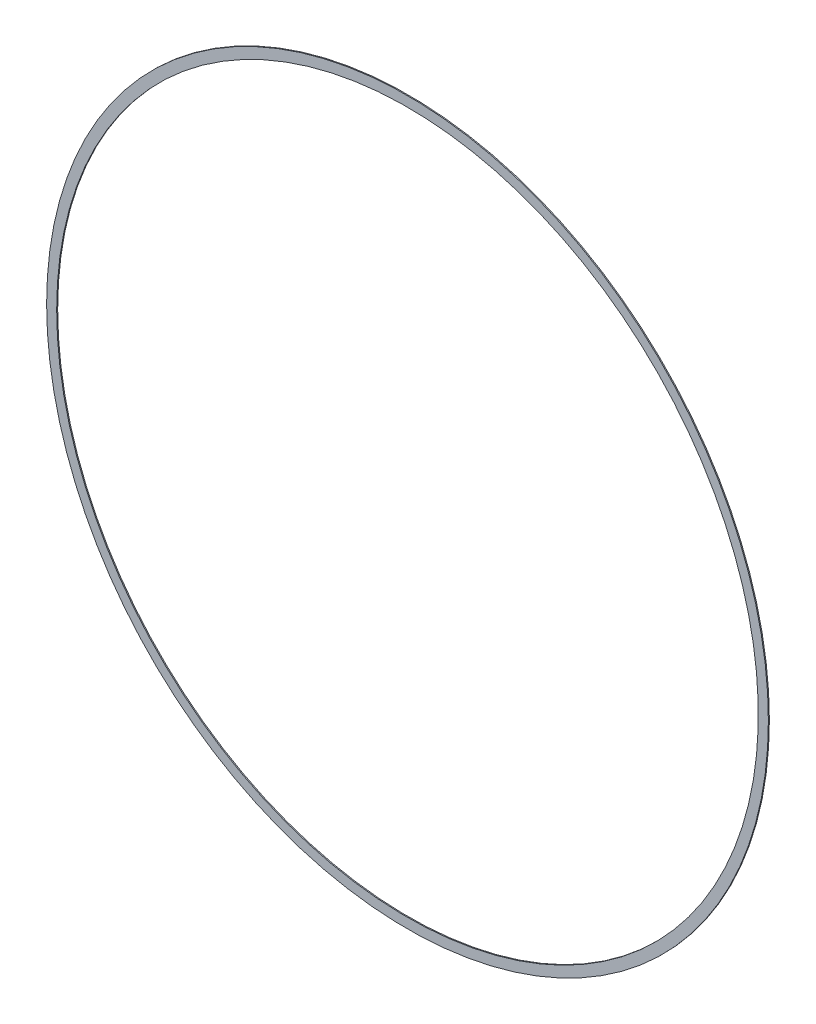
ISO-10303-21;
HEADER;
FILE_DESCRIPTION(('STEP AP214'),'2;1');
FILE_NAME('part.step','',(''),(''),'','','');
FILE_SCHEMA(('AUTOMOTIVE_DESIGN { 1 0 10303 214 1 1 1 1 }'));
ENDSEC;
DATA;
#1=APPLICATION_CONTEXT('core data for automotive mechanical design processes');
#2=APPLICATION_PROTOCOL_DEFINITION('international standard','automotive_design',2000,#1);
#3=PRODUCT_CONTEXT('',#1,'mechanical');
#4=PRODUCT('Part','Part','',(#3));
#5=PRODUCT_RELATED_PRODUCT_CATEGORY('part','',(#4));
#6=PRODUCT_DEFINITION_FORMATION('','',#4);
#7=PRODUCT_DEFINITION_CONTEXT('part definition',#1,'design');
#8=PRODUCT_DEFINITION('design','',#6,#7);
#9=PRODUCT_DEFINITION_SHAPE('','',#8);
#10=(LENGTH_UNIT() NAMED_UNIT(*) SI_UNIT(.MILLI.,.METRE.));
#11=(NAMED_UNIT(*) PLANE_ANGLE_UNIT() SI_UNIT($,.RADIAN.));
#12=(NAMED_UNIT(*) SI_UNIT($,.STERADIAN.) SOLID_ANGLE_UNIT());
#13=UNCERTAINTY_MEASURE_WITH_UNIT(LENGTH_MEASURE(1.E-05),#10,'distance_accuracy_value','');
#14=(GEOMETRIC_REPRESENTATION_CONTEXT(3) GLOBAL_UNCERTAINTY_ASSIGNED_CONTEXT((#13)) GLOBAL_UNIT_ASSIGNED_CONTEXT((#10,
#11,#12)) REPRESENTATION_CONTEXT('',''));
#15=CARTESIAN_POINT('',(0.,0.,0.));
#16=DIRECTION('',(0.,0.,1.));
#17=DIRECTION('',(1.,0.,0.));
#18=AXIS2_PLACEMENT_3D('',#15,#16,#17);
#19=CARTESIAN_POINT('',(0.,0.,3.));
#20=DIRECTION('',(0.,0.,1.));
#21=DIRECTION('',(1.,0.,0.));
#22=AXIS2_PLACEMENT_3D('',#19,#20,#21);
#23=PLANE('',#22);
#24=CARTESIAN_POINT('',(0.,0.,3.));
#25=DIRECTION('',(0.,0.,1.));
#26=DIRECTION('',(1.,0.,0.));
#27=AXIS2_PLACEMENT_3D('',#24,#25,#26);
#28=CIRCLE('',#27,1077.);
#29=CARTESIAN_POINT('',(-1077.,0.,3.));
#30=VERTEX_POINT('',#29);
#31=EDGE_CURVE('E11',#30,#30,#28,.T.);
#32=ORIENTED_EDGE('',*,*,#31,.T.);
#33=EDGE_LOOP('',(#32));
#34=FACE_BOUND('',#33,.T.);
#35=CARTESIAN_POINT('',(0.,0.,3.));
#36=DIRECTION('',(0.,0.,1.));
#37=DIRECTION('',(1.,0.,0.));
#38=AXIS2_PLACEMENT_3D('',#35,#36,#37);
#39=CIRCLE('',#38,1047.);
#40=CARTESIAN_POINT('',(-1047.,0.,3.));
#41=VERTEX_POINT('',#40);
#42=EDGE_CURVE('E47',#41,#41,#39,.T.);
#43=ORIENTED_EDGE('',*,*,#42,.F.);
#44=EDGE_LOOP('',(#43));
#45=FACE_BOUND('',#44,.T.);
#46=ADVANCED_FACE('F36',(#34,#45),#23,.T.);
#47=CARTESIAN_POINT('',(0.,0.,0.));
#48=DIRECTION('',(0.,0.,1.));
#49=DIRECTION('',(1.,0.,0.));
#50=AXIS2_PLACEMENT_3D('',#47,#48,#49);
#51=PLANE('',#50);
#52=CARTESIAN_POINT('',(0.,0.,0.));
#53=DIRECTION('',(0.,0.,1.));
#54=DIRECTION('',(1.,0.,0.));
#55=AXIS2_PLACEMENT_3D('',#52,#53,#54);
#56=CIRCLE('',#55,1077.);
#57=CARTESIAN_POINT('',(-1077.,0.,0.));
#58=VERTEX_POINT('',#57);
#59=EDGE_CURVE('E40',#58,#58,#56,.T.);
#60=ORIENTED_EDGE('',*,*,#59,.F.);
#61=EDGE_LOOP('',(#60));
#62=FACE_BOUND('',#61,.T.);
#63=CARTESIAN_POINT('',(0.,0.,0.));
#64=DIRECTION('',(0.,0.,1.));
#65=DIRECTION('',(1.,0.,0.));
#66=AXIS2_PLACEMENT_3D('',#63,#64,#65);
#67=CIRCLE('',#66,1047.);
#68=CARTESIAN_POINT('',(-1047.,0.,0.));
#69=VERTEX_POINT('',#68);
#70=EDGE_CURVE('E49',#69,#69,#67,.T.);
#71=ORIENTED_EDGE('',*,*,#70,.T.);
#72=EDGE_LOOP('',(#71));
#73=FACE_BOUND('',#72,.T.);
#74=ADVANCED_FACE('F59',(#62,#73),#51,.F.);
#75=CARTESIAN_POINT('',(0.,0.,3.));
#76=DIRECTION('',(0.,0.,-1.));
#77=DIRECTION('',(-1.,0.,0.));
#78=AXIS2_PLACEMENT_3D('',#75,#76,#77);
#79=CYLINDRICAL_SURFACE('',#78,1077.);
#80=CARTESIAN_POINT('',(-1077.,0.,3.));
#81=CARTESIAN_POINT('',(-1077.,0.,2.96875));
#82=CARTESIAN_POINT('',(-1077.,0.,2.9375));
#83=CARTESIAN_POINT('',(-1077.,0.,2.875));
#84=CARTESIAN_POINT('',(-1077.,0.,2.84375));
#85=CARTESIAN_POINT('',(-1077.,0.,2.78125));
#86=CARTESIAN_POINT('',(-1077.,0.,2.75));
#87=CARTESIAN_POINT('',(-1077.,0.,2.6875));
#88=CARTESIAN_POINT('',(-1077.,0.,2.65625));
#89=CARTESIAN_POINT('',(-1077.,0.,2.59375));
#90=CARTESIAN_POINT('',(-1077.,0.,2.5625));
#91=CARTESIAN_POINT('',(-1077.,0.,2.5));
#92=CARTESIAN_POINT('',(-1077.,0.,2.46875));
#93=CARTESIAN_POINT('',(-1077.,0.,2.40625));
#94=CARTESIAN_POINT('',(-1077.,0.,2.375));
#95=CARTESIAN_POINT('',(-1077.,0.,2.3125));
#96=CARTESIAN_POINT('',(-1077.,0.,2.28125));
#97=CARTESIAN_POINT('',(-1077.,0.,2.21875));
#98=CARTESIAN_POINT('',(-1077.,0.,2.1875));
#99=CARTESIAN_POINT('',(-1077.,0.,2.125));
#100=CARTESIAN_POINT('',(-1077.,0.,2.09375));
#101=CARTESIAN_POINT('',(-1077.,0.,2.03125));
#102=CARTESIAN_POINT('',(-1077.,0.,2.));
#103=CARTESIAN_POINT('',(-1077.,0.,1.9375));
#104=CARTESIAN_POINT('',(-1077.,0.,1.90625));
#105=CARTESIAN_POINT('',(-1077.,0.,1.84375));
#106=CARTESIAN_POINT('',(-1077.,0.,1.8125));
#107=CARTESIAN_POINT('',(-1077.,0.,1.75));
#108=CARTESIAN_POINT('',(-1077.,0.,1.71875));
#109=CARTESIAN_POINT('',(-1077.,0.,1.65625));
#110=CARTESIAN_POINT('',(-1077.,0.,1.625));
#111=CARTESIAN_POINT('',(-1077.,0.,1.5625));
#112=CARTESIAN_POINT('',(-1077.,0.,1.53125));
#113=CARTESIAN_POINT('',(-1077.,0.,1.46875));
#114=CARTESIAN_POINT('',(-1077.,0.,1.4375));
#115=CARTESIAN_POINT('',(-1077.,0.,1.375));
#116=CARTESIAN_POINT('',(-1077.,0.,1.34375));
#117=CARTESIAN_POINT('',(-1077.,0.,1.28125));
#118=CARTESIAN_POINT('',(-1077.,0.,1.25));
#119=CARTESIAN_POINT('',(-1077.,0.,1.1875));
#120=CARTESIAN_POINT('',(-1077.,0.,1.15625));
#121=CARTESIAN_POINT('',(-1077.,0.,1.09375));
#122=CARTESIAN_POINT('',(-1077.,0.,1.0625));
#123=CARTESIAN_POINT('',(-1077.,0.,1.));
#124=CARTESIAN_POINT('',(-1077.,0.,0.96875));
#125=CARTESIAN_POINT('',(-1077.,0.,0.90625));
#126=CARTESIAN_POINT('',(-1077.,0.,0.875));
#127=CARTESIAN_POINT('',(-1077.,0.,0.8125));
#128=CARTESIAN_POINT('',(-1077.,0.,0.78125));
#129=CARTESIAN_POINT('',(-1077.,0.,0.71875));
#130=CARTESIAN_POINT('',(-1077.,0.,0.6875));
#131=CARTESIAN_POINT('',(-1077.,0.,0.625));
#132=CARTESIAN_POINT('',(-1077.,0.,0.59375));
#133=CARTESIAN_POINT('',(-1077.,0.,0.53125));
#134=CARTESIAN_POINT('',(-1077.,0.,0.5));
#135=CARTESIAN_POINT('',(-1077.,0.,0.4375));
#136=CARTESIAN_POINT('',(-1077.,0.,0.40625));
#137=CARTESIAN_POINT('',(-1077.,0.,0.34375));
#138=CARTESIAN_POINT('',(-1077.,0.,0.3125));
#139=CARTESIAN_POINT('',(-1077.,0.,0.25));
#140=CARTESIAN_POINT('',(-1077.,0.,0.21875));
#141=CARTESIAN_POINT('',(-1077.,0.,0.15625));
#142=CARTESIAN_POINT('',(-1077.,0.,0.125));
#143=CARTESIAN_POINT('',(-1077.,0.,0.0624999999999996));
#144=CARTESIAN_POINT('',(-1077.,0.,0.0312499999999996));
#145=CARTESIAN_POINT('',(-1077.,0.,0.));
#146=B_SPLINE_CURVE_WITH_KNOTS('',3,(#80,#81,#82,#83,#84,#85,#86,#87,#88,#89,#90,#91,#92,#93,
#94,#95,#96,#97,#98,#99,#100,#101,#102,#103,#104,#105,#106,#107,#108,#109,#110,#111,#112,#113,
#114,#115,#116,#117,#118,#119,#120,#121,#122,#123,#124,#125,#126,#127,#128,#129,#130,#131,#132,
#133,#134,#135,#136,#137,#138,#139,#140,#141,#142,#143,#144,#145),.UNSPECIFIED.,.F.,.F.,(4,2,2,
2,2,2,2,2,2,2,2,2,2,2,2,2,2,2,2,2,2,2,2,2,2,2,2,2,2,2,2,2,4),(0.,0.0937499999999997,0.1875,
0.28125,0.375,0.46875,0.5625,0.65625,0.75,0.84375,0.9375,1.03125,1.125,1.21875,1.3125,1.40625,
1.5,1.59375,1.6875,1.78125,1.875,1.96875,2.0625,2.15625,2.25,2.34375,2.4375,2.53125,2.625,
2.71875,2.8125,2.90625,3.),.UNSPECIFIED.);
#147=EDGE_CURVE('BSEAM38',#30,#58,#146,.T.);
#148=ORIENTED_EDGE('',*,*,#31,.F.);
#149=ORIENTED_EDGE('',*,*,#59,.T.);
#150=ORIENTED_EDGE('',*,*,#147,.T.);
#151=ORIENTED_EDGE('',*,*,#147,.F.);
#152=EDGE_LOOP('',(#148,#150,#149,#151));
#153=FACE_BOUND('',#152,.T.);
#154=ADVANCED_FACE('F38',(#153),#79,.T.);
#155=CARTESIAN_POINT('',(0.,0.,3.));
#156=DIRECTION('',(0.,0.,-1.));
#157=DIRECTION('',(-1.,0.,0.));
#158=AXIS2_PLACEMENT_3D('',#155,#156,#157);
#159=CYLINDRICAL_SURFACE('',#158,1047.);
#160=CARTESIAN_POINT('',(-1047.,0.,3.));
#161=CARTESIAN_POINT('',(-1047.,0.,2.96875));
#162=CARTESIAN_POINT('',(-1047.,0.,2.9375));
#163=CARTESIAN_POINT('',(-1047.,0.,2.875));
#164=CARTESIAN_POINT('',(-1047.,0.,2.84375));
#165=CARTESIAN_POINT('',(-1047.,0.,2.78125));
#166=CARTESIAN_POINT('',(-1047.,0.,2.75));
#167=CARTESIAN_POINT('',(-1047.,0.,2.6875));
#168=CARTESIAN_POINT('',(-1047.,0.,2.65625));
#169=CARTESIAN_POINT('',(-1047.,0.,2.59375));
#170=CARTESIAN_POINT('',(-1047.,0.,2.5625));
#171=CARTESIAN_POINT('',(-1047.,0.,2.5));
#172=CARTESIAN_POINT('',(-1047.,0.,2.46875));
#173=CARTESIAN_POINT('',(-1047.,0.,2.40625));
#174=CARTESIAN_POINT('',(-1047.,0.,2.375));
#175=CARTESIAN_POINT('',(-1047.,0.,2.3125));
#176=CARTESIAN_POINT('',(-1047.,0.,2.28125));
#177=CARTESIAN_POINT('',(-1047.,0.,2.21875));
#178=CARTESIAN_POINT('',(-1047.,0.,2.1875));
#179=CARTESIAN_POINT('',(-1047.,0.,2.125));
#180=CARTESIAN_POINT('',(-1047.,0.,2.09375));
#181=CARTESIAN_POINT('',(-1047.,0.,2.03125));
#182=CARTESIAN_POINT('',(-1047.,0.,2.));
#183=CARTESIAN_POINT('',(-1047.,0.,1.9375));
#184=CARTESIAN_POINT('',(-1047.,0.,1.90625));
#185=CARTESIAN_POINT('',(-1047.,0.,1.84375));
#186=CARTESIAN_POINT('',(-1047.,0.,1.8125));
#187=CARTESIAN_POINT('',(-1047.,0.,1.75));
#188=CARTESIAN_POINT('',(-1047.,0.,1.71875));
#189=CARTESIAN_POINT('',(-1047.,0.,1.65625));
#190=CARTESIAN_POINT('',(-1047.,0.,1.625));
#191=CARTESIAN_POINT('',(-1047.,0.,1.5625));
#192=CARTESIAN_POINT('',(-1047.,0.,1.53125));
#193=CARTESIAN_POINT('',(-1047.,0.,1.46875));
#194=CARTESIAN_POINT('',(-1047.,0.,1.4375));
#195=CARTESIAN_POINT('',(-1047.,0.,1.375));
#196=CARTESIAN_POINT('',(-1047.,0.,1.34375));
#197=CARTESIAN_POINT('',(-1047.,0.,1.28125));
#198=CARTESIAN_POINT('',(-1047.,0.,1.25));
#199=CARTESIAN_POINT('',(-1047.,0.,1.1875));
#200=CARTESIAN_POINT('',(-1047.,0.,1.15625));
#201=CARTESIAN_POINT('',(-1047.,0.,1.09375));
#202=CARTESIAN_POINT('',(-1047.,0.,1.0625));
#203=CARTESIAN_POINT('',(-1047.,0.,1.));
#204=CARTESIAN_POINT('',(-1047.,0.,0.96875));
#205=CARTESIAN_POINT('',(-1047.,0.,0.90625));
#206=CARTESIAN_POINT('',(-1047.,0.,0.875));
#207=CARTESIAN_POINT('',(-1047.,0.,0.8125));
#208=CARTESIAN_POINT('',(-1047.,0.,0.78125));
#209=CARTESIAN_POINT('',(-1047.,0.,0.71875));
#210=CARTESIAN_POINT('',(-1047.,0.,0.6875));
#211=CARTESIAN_POINT('',(-1047.,0.,0.625));
#212=CARTESIAN_POINT('',(-1047.,0.,0.59375));
#213=CARTESIAN_POINT('',(-1047.,0.,0.53125));
#214=CARTESIAN_POINT('',(-1047.,0.,0.5));
#215=CARTESIAN_POINT('',(-1047.,0.,0.4375));
#216=CARTESIAN_POINT('',(-1047.,0.,0.40625));
#217=CARTESIAN_POINT('',(-1047.,0.,0.34375));
#218=CARTESIAN_POINT('',(-1047.,0.,0.3125));
#219=CARTESIAN_POINT('',(-1047.,0.,0.25));
#220=CARTESIAN_POINT('',(-1047.,0.,0.21875));
#221=CARTESIAN_POINT('',(-1047.,0.,0.15625));
#222=CARTESIAN_POINT('',(-1047.,0.,0.125));
#223=CARTESIAN_POINT('',(-1047.,0.,0.0624999999999996));
#224=CARTESIAN_POINT('',(-1047.,0.,0.0312499999999996));
#225=CARTESIAN_POINT('',(-1047.,0.,0.));
#226=B_SPLINE_CURVE_WITH_KNOTS('',3,(#160,#161,#162,#163,#164,#165,#166,#167,#168,#169,#170,
#171,#172,#173,#174,#175,#176,#177,#178,#179,#180,#181,#182,#183,#184,#185,#186,#187,#188,#189,
#190,#191,#192,#193,#194,#195,#196,#197,#198,#199,#200,#201,#202,#203,#204,#205,#206,#207,#208,
#209,#210,#211,#212,#213,#214,#215,#216,#217,#218,#219,#220,#221,#222,#223,#224,#225),
.UNSPECIFIED.,.F.,.F.,(4,2,2,2,2,2,2,2,2,2,2,2,2,2,2,2,2,2,2,2,2,2,2,2,2,2,2,2,2,2,2,2,4),(0.,
0.0937499999999997,0.1875,0.28125,0.375,0.46875,0.5625,0.65625,0.75,0.84375,0.9375,1.03125,
1.125,1.21875,1.3125,1.40625,1.5,1.59375,1.6875,1.78125,1.875,1.96875,2.0625,2.15625,2.25,
2.34375,2.4375,2.53125,2.625,2.71875,2.8125,2.90625,3.),.UNSPECIFIED.);
#227=EDGE_CURVE('BSEAM55',#41,#69,#226,.T.);
#228=ORIENTED_EDGE('',*,*,#42,.T.);
#229=ORIENTED_EDGE('',*,*,#70,.F.);
#230=ORIENTED_EDGE('',*,*,#227,.T.);
#231=ORIENTED_EDGE('',*,*,#227,.F.);
#232=EDGE_LOOP('',(#228,#230,#229,#231));
#233=FACE_BOUND('',#232,.T.);
#234=ADVANCED_FACE('F55',(#233),#159,.F.);
#235=CLOSED_SHELL('',(#46,#74,#154,#234));
#236=MANIFOLD_SOLID_BREP('B2',#235);
#237=ADVANCED_BREP_SHAPE_REPRESENTATION('',(#18,#236),#14);
#238=SHAPE_DEFINITION_REPRESENTATION(#9,#237);
ENDSEC;
END-ISO-10303-21;
